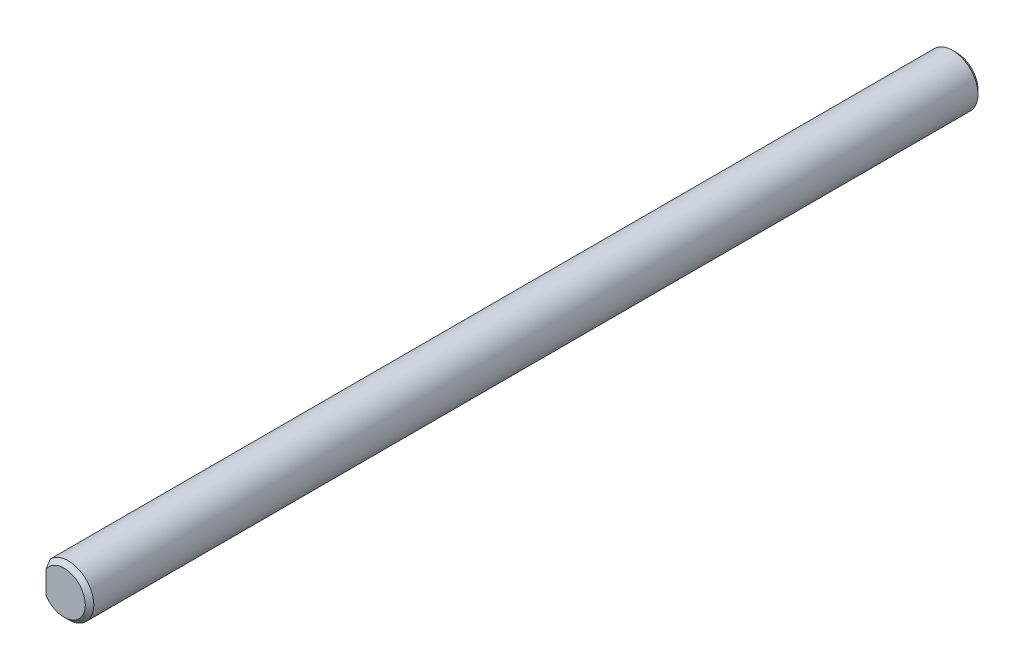
ISO-10303-21;
HEADER;
FILE_DESCRIPTION(('STEP AP214'),'2;1');
FILE_NAME('part.step','',(''),(''),'','','');
FILE_SCHEMA(('AUTOMOTIVE_DESIGN { 1 0 10303 214 1 1 1 1 }'));
ENDSEC;
DATA;
#1=APPLICATION_CONTEXT('core data for automotive mechanical design processes');
#2=APPLICATION_PROTOCOL_DEFINITION('international standard','automotive_design',2000,#1);
#3=PRODUCT_CONTEXT('',#1,'mechanical');
#4=PRODUCT('Part','Part','',(#3));
#5=PRODUCT_RELATED_PRODUCT_CATEGORY('part','',(#4));
#6=PRODUCT_DEFINITION_FORMATION('','',#4);
#7=PRODUCT_DEFINITION_CONTEXT('part definition',#1,'design');
#8=PRODUCT_DEFINITION('design','',#6,#7);
#9=PRODUCT_DEFINITION_SHAPE('','',#8);
#10=(LENGTH_UNIT() NAMED_UNIT(*) SI_UNIT(.MILLI.,.METRE.));
#11=(NAMED_UNIT(*) PLANE_ANGLE_UNIT() SI_UNIT($,.RADIAN.));
#12=(NAMED_UNIT(*) SI_UNIT($,.STERADIAN.) SOLID_ANGLE_UNIT());
#13=UNCERTAINTY_MEASURE_WITH_UNIT(LENGTH_MEASURE(1.E-05),#10,'distance_accuracy_value','');
#14=(GEOMETRIC_REPRESENTATION_CONTEXT(3) GLOBAL_UNCERTAINTY_ASSIGNED_CONTEXT((#13)) GLOBAL_UNIT_ASSIGNED_CONTEXT((#10,
#11,#12)) REPRESENTATION_CONTEXT('',''));
#15=CARTESIAN_POINT('',(0.,0.,0.));
#16=DIRECTION('',(0.,0.,1.));
#17=DIRECTION('',(1.,0.,0.));
#18=AXIS2_PLACEMENT_3D('',#15,#16,#17);
#19=CARTESIAN_POINT('',(0.,0.,105.));
#20=DIRECTION('',(0.,0.,-1.));
#21=DIRECTION('',(-1.,0.,0.));
#22=AXIS2_PLACEMENT_3D('',#19,#20,#21);
#23=CYLINDRICAL_SURFACE('',#22,3.);
#24=DIRECTION('',(0.,0.,1.));
#25=VECTOR('',#24,1.);
#26=CARTESIAN_POINT('',(-2.12132034355964,2.12132034355964,95.));
#27=LINE('',#26,#25);
#28=CARTESIAN_POINT('',(-2.12132034355964,2.12132034355964,95.));
#29=VERTEX_POINT('',#28);
#30=CARTESIAN_POINT('',(-2.12132034355964,2.12132034355964,104.5));
#31=VERTEX_POINT('',#30);
#32=EDGE_CURVE('E1365',#29,#31,#27,.T.);
#33=ORIENTED_EDGE('',*,*,#32,.T.);
#34=CARTESIAN_POINT('',(0.,0.,104.5));
#35=DIRECTION('',(0.,0.,1.));
#36=DIRECTION('',(1.,0.,0.));
#37=AXIS2_PLACEMENT_3D('',#34,#35,#36);
#38=CIRCLE('',#37,3.);
#39=CARTESIAN_POINT('',(-2.12132034355964,-2.12132034355964,104.5));
#40=VERTEX_POINT('',#39);
#41=EDGE_CURVE('E1387',#31,#40,#38,.F.);
#42=ORIENTED_EDGE('',*,*,#41,.T.);
#43=DIRECTION('',(0.,0.,1.));
#44=VECTOR('',#43,1.);
#45=CARTESIAN_POINT('',(-2.12132034355964,-2.12132034355964,95.));
#46=LINE('',#45,#44);
#47=CARTESIAN_POINT('',(-2.12132034355964,-2.12132034355964,95.));
#48=VERTEX_POINT('',#47);
#49=EDGE_CURVE('E1363',#48,#40,#46,.T.);
#50=ORIENTED_EDGE('',*,*,#49,.F.);
#51=CARTESIAN_POINT('',(0.,0.,95.));
#52=DIRECTION('',(0.,0.,1.));
#53=DIRECTION('',(1.,0.,0.));
#54=AXIS2_PLACEMENT_3D('',#51,#52,#53);
#55=CIRCLE('',#54,3.);
#56=EDGE_CURVE('E1353',#29,#48,#55,.T.);
#57=ORIENTED_EDGE('',*,*,#56,.F.);
#58=EDGE_LOOP('',(#33,#42,#50,#57));
#59=FACE_BOUND('',#58,.T.);
#60=DIRECTION('',(0.,0.,-1.));
#61=VECTOR('',#60,1.);
#62=CARTESIAN_POINT('',(-2.12132034355964,-2.12132034355964,30.));
#63=LINE('',#62,#61);
#64=CARTESIAN_POINT('',(-2.12132034355964,-2.12132034355964,30.));
#65=VERTEX_POINT('',#64);
#66=CARTESIAN_POINT('',(-2.12132034355964,-2.12132034355964,0.5));
#67=VERTEX_POINT('',#66);
#68=EDGE_CURVE('E1383',#65,#67,#63,.T.);
#69=ORIENTED_EDGE('',*,*,#68,.T.);
#70=CARTESIAN_POINT('',(0.,0.,0.5));
#71=DIRECTION('',(0.,0.,1.));
#72=DIRECTION('',(1.,0.,0.));
#73=AXIS2_PLACEMENT_3D('',#70,#71,#72);
#74=CIRCLE('',#73,3.);
#75=CARTESIAN_POINT('',(-2.12132034355964,2.12132034355964,0.5));
#76=VERTEX_POINT('',#75);
#77=EDGE_CURVE('E1393',#67,#76,#74,.T.);
#78=ORIENTED_EDGE('',*,*,#77,.T.);
#79=DIRECTION('',(0.,0.,-1.));
#80=VECTOR('',#79,1.);
#81=CARTESIAN_POINT('',(-2.12132034355964,2.12132034355964,30.));
#82=LINE('',#81,#80);
#83=CARTESIAN_POINT('',(-2.12132034355964,2.12132034355964,30.));
#84=VERTEX_POINT('',#83);
#85=EDGE_CURVE('E1379',#84,#76,#82,.T.);
#86=ORIENTED_EDGE('',*,*,#85,.F.);
#87=CARTESIAN_POINT('',(0.,0.,30.));
#88=DIRECTION('',(0.,0.,-1.));
#89=DIRECTION('',(-1.,0.,0.));
#90=AXIS2_PLACEMENT_3D('',#87,#88,#89);
#91=CIRCLE('',#90,3.);
#92=EDGE_CURVE('E1372',#65,#84,#91,.T.);
#93=ORIENTED_EDGE('',*,*,#92,.F.);
#94=EDGE_LOOP('',(#69,#78,#86,#93));
#95=FACE_BOUND('',#94,.T.);
#96=ADVANCED_FACE('F1273',(#59,#95),#23,.T.);
#97=CARTESIAN_POINT('',(0.,0.,105.));
#98=DIRECTION('',(0.,0.,1.));
#99=DIRECTION('',(1.,0.,0.));
#100=AXIS2_PLACEMENT_3D('',#97,#98,#99);
#101=PLANE('',#100);
#102=DIRECTION('',(0.,1.,0.));
#103=VECTOR('',#102,1.);
#104=CARTESIAN_POINT('',(-2.12132034355964,0.,105.));
#105=LINE('',#104,#103);
#106=CARTESIAN_POINT('',(-2.12132034355964,-1.32287565553233,105.));
#107=VERTEX_POINT('',#106);
#108=CARTESIAN_POINT('',(-2.12132034355964,1.32287565553233,105.));
#109=VERTEX_POINT('',#108);
#110=EDGE_CURVE('E1346',#107,#109,#105,.T.);
#111=ORIENTED_EDGE('',*,*,#110,.F.);
#112=CARTESIAN_POINT('',(0.,0.,105.));
#113=DIRECTION('',(0.,0.,1.));
#114=DIRECTION('',(1.,0.,0.));
#115=AXIS2_PLACEMENT_3D('',#112,#113,#114);
#116=CIRCLE('',#115,2.50000000000002);
#117=EDGE_CURVE('E1450',#107,#109,#116,.T.);
#118=ORIENTED_EDGE('',*,*,#117,.T.);
#119=EDGE_LOOP('',(#111,#118));
#120=FACE_BOUND('',#119,.T.);
#121=ADVANCED_FACE('F1423',(#120),#101,.T.);
#122=CARTESIAN_POINT('',(0.,0.,0.));
#123=DIRECTION('',(0.,0.,1.));
#124=DIRECTION('',(1.,0.,0.));
#125=AXIS2_PLACEMENT_3D('',#122,#123,#124);
#126=PLANE('',#125);
#127=CARTESIAN_POINT('',(0.,0.,0.));
#128=DIRECTION('',(0.,0.,-1.));
#129=DIRECTION('',(-1.,0.,0.));
#130=AXIS2_PLACEMENT_3D('',#127,#128,#129);
#131=CIRCLE('',#130,1.24999999999999);
#132=CARTESIAN_POINT('',(-1.24999999999999,0.,0.));
#133=VERTEX_POINT('',#132);
#134=EDGE_CURVE('E1347',#133,#133,#131,.T.);
#135=ORIENTED_EDGE('',*,*,#134,.F.);
#136=EDGE_LOOP('',(#135));
#137=FACE_BOUND('',#136,.T.);
#138=DIRECTION('',(0.,-1.,0.));
#139=VECTOR('',#138,1.);
#140=CARTESIAN_POINT('',(-2.12132034355964,0.,0.));
#141=LINE('',#140,#139);
#142=CARTESIAN_POINT('',(-2.12132034355964,1.3228756555323,0.));
#143=VERTEX_POINT('',#142);
#144=CARTESIAN_POINT('',(-2.12132034355964,-1.3228756555323,0.));
#145=VERTEX_POINT('',#144);
#146=EDGE_CURVE('E1369',#143,#145,#141,.T.);
#147=ORIENTED_EDGE('',*,*,#146,.F.);
#148=CARTESIAN_POINT('',(0.,0.,0.));
#149=DIRECTION('',(0.,0.,1.));
#150=DIRECTION('',(1.,0.,0.));
#151=AXIS2_PLACEMENT_3D('',#148,#149,#150);
#152=CIRCLE('',#151,2.5);
#153=EDGE_CURVE('E1444',#143,#145,#152,.F.);
#154=ORIENTED_EDGE('',*,*,#153,.T.);
#155=EDGE_LOOP('',(#147,#154));
#156=FACE_BOUND('',#155,.T.);
#157=ADVANCED_FACE('F1421',(#137,#156),#126,.F.);
#158=CARTESIAN_POINT('',(-2.12132034355964,0.,30.));
#159=DIRECTION('',(1.,0.,0.));
#160=DIRECTION('',(0.,0.,-1.));
#161=AXIS2_PLACEMENT_3D('',#158,#159,#160);
#162=PLANE('',#161);
#163=ORIENTED_EDGE('',*,*,#85,.T.);
#164=CARTESIAN_POINT('',(-2.12132034355964,2.12132034355964,0.5));
#165=CARTESIAN_POINT('',(-2.12132034355964,2.057150349237,0.454641875638872));
#166=CARTESIAN_POINT('',(-2.12132034355964,1.99250337372897,0.409942314784703));
#167=CARTESIAN_POINT('',(-2.12132034355964,1.86214332555769,0.322273768220019));
#168=CARTESIAN_POINT('',(-2.12132034355964,1.7964313951967,0.279303080777996));
#169=CARTESIAN_POINT('',(-2.12132034355964,1.66368168334487,0.195400793709425));
#170=CARTESIAN_POINT('',(-2.12132034355964,1.5966435323941,0.154469773796638));
#171=CARTESIAN_POINT('',(-2.12132034355964,1.46098397930878,0.0751655929118614));
#172=CARTESIAN_POINT('',(-2.12132034355964,1.39236104081728,0.0367950674542279));
#173=CARTESIAN_POINT('',(-2.12132034355964,1.3228756555323,0.));
#174=B_SPLINE_CURVE_WITH_KNOTS('',3,(#164,#165,#166,#167,#168,#169,#170,#171,#172,#173),
.UNSPECIFIED.,.F.,.F.,(4,2,2,2,4),(0.,0.235755368792439,0.471272703908698,0.706856600308596,
0.942679357394607),.UNSPECIFIED.);
#175=EDGE_CURVE('E1405',#76,#143,#174,.T.);
#176=ORIENTED_EDGE('',*,*,#175,.T.);
#177=ORIENTED_EDGE('',*,*,#146,.T.);
#178=CARTESIAN_POINT('',(-2.12132034355964,-1.3228756555323,0.));
#179=CARTESIAN_POINT('',(-2.12132034355964,-1.39236104081728,0.0367950674542276));
#180=CARTESIAN_POINT('',(-2.12132034355964,-1.46098397930878,0.0751655929118612));
#181=CARTESIAN_POINT('',(-2.12132034355964,-1.5966435323941,0.154469773796638));
#182=CARTESIAN_POINT('',(-2.12132034355964,-1.66368168334487,0.195400793709425));
#183=CARTESIAN_POINT('',(-2.12132034355964,-1.7964313951967,0.279303080777997));
#184=CARTESIAN_POINT('',(-2.12132034355964,-1.86214332555769,0.32227376822002));
#185=CARTESIAN_POINT('',(-2.12132034355964,-1.99250337372897,0.409942314784703));
#186=CARTESIAN_POINT('',(-2.12132034355964,-2.057150349237,0.454641875638872));
#187=CARTESIAN_POINT('',(-2.12132034355964,-2.12132034355964,0.5));
#188=B_SPLINE_CURVE_WITH_KNOTS('',3,(#178,#179,#180,#181,#182,#183,#184,#185,#186,#187),
.UNSPECIFIED.,.F.,.F.,(4,2,2,2,4),(0.,0.235822757086011,0.47140665348591,0.706923988602168,
0.942679357394607),.UNSPECIFIED.);
#189=EDGE_CURVE('E1397',#145,#67,#188,.T.);
#190=ORIENTED_EDGE('',*,*,#189,.T.);
#191=ORIENTED_EDGE('',*,*,#68,.F.);
#192=DIRECTION('',(0.,-1.,0.));
#193=VECTOR('',#192,1.);
#194=CARTESIAN_POINT('',(-2.12132034355964,0.,30.));
#195=LINE('',#194,#193);
#196=EDGE_CURVE('E1375',#84,#65,#195,.T.);
#197=ORIENTED_EDGE('',*,*,#196,.F.);
#198=EDGE_LOOP('',(#163,#176,#177,#190,#191,#197));
#199=FACE_BOUND('',#198,.T.);
#200=ADVANCED_FACE('F1415',(#199),#162,.F.);
#201=CARTESIAN_POINT('',(0.,0.,30.));
#202=DIRECTION('',(0.,0.,-1.));
#203=DIRECTION('',(-1.,0.,0.));
#204=AXIS2_PLACEMENT_3D('',#201,#202,#203);
#205=PLANE('',#204);
#206=ORIENTED_EDGE('',*,*,#92,.T.);
#207=ORIENTED_EDGE('',*,*,#196,.T.);
#208=EDGE_LOOP('',(#206,#207));
#209=FACE_BOUND('',#208,.T.);
#210=ADVANCED_FACE('F1420',(#209),#205,.T.);
#211=CARTESIAN_POINT('',(-2.12132034355964,0.,95.));
#212=DIRECTION('',(1.,0.,0.));
#213=DIRECTION('',(0.,0.,-1.));
#214=AXIS2_PLACEMENT_3D('',#211,#212,#213);
#215=PLANE('',#214);
#216=ORIENTED_EDGE('',*,*,#110,.T.);
#217=CARTESIAN_POINT('',(-2.12132034355964,1.32287565553233,105.));
#218=CARTESIAN_POINT('',(-2.12132034355964,1.39236104081731,104.963204932546));
#219=CARTESIAN_POINT('',(-2.12132034355964,1.46098397930881,104.924834407088));
#220=CARTESIAN_POINT('',(-2.12132034355964,1.59664353239412,104.845530226203));
#221=CARTESIAN_POINT('',(-2.12132034355964,1.66368168334489,104.804599206291));
#222=CARTESIAN_POINT('',(-2.12132034355964,1.79643139519671,104.720696919222));
#223=CARTESIAN_POINT('',(-2.12132034355964,1.8621433255577,104.67772623178));
#224=CARTESIAN_POINT('',(-2.12132034355964,1.99250337372898,104.590057685215));
#225=CARTESIAN_POINT('',(-2.12132034355964,2.057150349237,104.545358124361));
#226=CARTESIAN_POINT('',(-2.12132034355964,2.12132034355964,104.5));
#227=B_SPLINE_CURVE_WITH_KNOTS('',3,(#217,#218,#219,#220,#221,#222,#223,#224,#225,#226),
.UNSPECIFIED.,.F.,.F.,(4,2,2,2,4),(0.,0.235822757086013,0.471406653485888,0.706923988602149,
0.942679357394577),.UNSPECIFIED.);
#228=EDGE_CURVE('E12',#109,#31,#227,.T.);
#229=ORIENTED_EDGE('',*,*,#228,.T.);
#230=ORIENTED_EDGE('',*,*,#32,.F.);
#231=DIRECTION('',(0.,1.,0.));
#232=VECTOR('',#231,1.);
#233=CARTESIAN_POINT('',(-2.12132034355964,0.,95.));
#234=LINE('',#233,#232);
#235=EDGE_CURVE('E1360',#48,#29,#234,.T.);
#236=ORIENTED_EDGE('',*,*,#235,.F.);
#237=ORIENTED_EDGE('',*,*,#49,.T.);
#238=CARTESIAN_POINT('',(-2.12132034355964,-2.12132034355964,104.5));
#239=CARTESIAN_POINT('',(-2.12132034355964,-2.057150349237,104.545358124361));
#240=CARTESIAN_POINT('',(-2.12132034355964,-1.99250337372898,104.590057685215));
#241=CARTESIAN_POINT('',(-2.12132034355964,-1.8621433255577,104.67772623178));
#242=CARTESIAN_POINT('',(-2.12132034355964,-1.79643139519671,104.720696919222));
#243=CARTESIAN_POINT('',(-2.12132034355964,-1.66368168334489,104.804599206291));
#244=CARTESIAN_POINT('',(-2.12132034355964,-1.59664353239411,104.845530226203));
#245=CARTESIAN_POINT('',(-2.12132034355964,-1.4609839793088,104.924834407088));
#246=CARTESIAN_POINT('',(-2.12132034355964,-1.3923610408173,104.963204932546));
#247=CARTESIAN_POINT('',(-2.12132034355964,-1.32287565553232,105.));
#248=B_SPLINE_CURVE_WITH_KNOTS('',3,(#238,#239,#240,#241,#242,#243,#244,#245,#246,#247),
.UNSPECIFIED.,.F.,.F.,(4,2,2,2,4),(0.,0.235755368792429,0.47127270390869,0.706856600308571,
0.94267935739458),.UNSPECIFIED.);
#249=EDGE_CURVE('E1289',#40,#107,#248,.T.);
#250=ORIENTED_EDGE('',*,*,#249,.T.);
#251=EDGE_LOOP('',(#216,#229,#230,#236,#237,#250));
#252=FACE_BOUND('',#251,.T.);
#253=ADVANCED_FACE('F1461',(#252),#215,.F.);
#254=CARTESIAN_POINT('',(0.,0.,95.));
#255=DIRECTION('',(0.,0.,1.));
#256=DIRECTION('',(1.,0.,0.));
#257=AXIS2_PLACEMENT_3D('',#254,#255,#256);
#258=PLANE('',#257);
#259=ORIENTED_EDGE('',*,*,#56,.T.);
#260=ORIENTED_EDGE('',*,*,#235,.T.);
#261=EDGE_LOOP('',(#259,#260));
#262=FACE_BOUND('',#261,.T.);
#263=ADVANCED_FACE('F1339',(#262),#258,.T.);
#264=CARTESIAN_POINT('',(0.,0.,10.));
#265=DIRECTION('',(0.,0.,-1.));
#266=DIRECTION('',(-1.,0.,0.));
#267=AXIS2_PLACEMENT_3D('',#264,#265,#266);
#268=CONICAL_SURFACE('',#267,1.25,1.02974425867665);
#269=CARTESIAN_POINT('',(0.,0.,10.7510757737845));
#270=VERTEX_POINT('',#269);
#271=VERTEX_LOOP('',#270);
#272=FACE_BOUND('',#271,.T.);
#273=CARTESIAN_POINT('',(0.,0.,10.));
#274=DIRECTION('',(0.,0.,-1.));
#275=DIRECTION('',(-1.,0.,0.));
#276=AXIS2_PLACEMENT_3D('',#273,#274,#275);
#277=CIRCLE('',#276,1.25);
#278=CARTESIAN_POINT('',(-1.25,0.,10.));
#279=VERTEX_POINT('',#278);
#280=EDGE_CURVE('E1343',#279,#279,#277,.T.);
#281=ORIENTED_EDGE('',*,*,#280,.T.);
#282=EDGE_LOOP('',(#281));
#283=FACE_BOUND('',#282,.T.);
#284=ADVANCED_FACE('F1335',(#272,#283),#268,.F.);
#285=CARTESIAN_POINT('',(0.,0.,0.));
#286=DIRECTION('',(0.,0.,-1.));
#287=DIRECTION('',(-1.,0.,0.));
#288=AXIS2_PLACEMENT_3D('',#285,#286,#287);
#289=CYLINDRICAL_SURFACE('',#288,1.24999999999999);
#290=ORIENTED_EDGE('',*,*,#280,.F.);
#291=EDGE_LOOP('',(#290));
#292=FACE_BOUND('',#291,.T.);
#293=ORIENTED_EDGE('',*,*,#134,.T.);
#294=EDGE_LOOP('',(#293));
#295=FACE_BOUND('',#294,.T.);
#296=ADVANCED_FACE('F1338',(#292,#295),#289,.F.);
#297=CARTESIAN_POINT('',(0.,0.,0.5));
#298=DIRECTION('',(0.,0.,1.));
#299=DIRECTION('',(1.,0.,0.));
#300=AXIS2_PLACEMENT_3D('',#297,#298,#299);
#301=CONICAL_SURFACE('',#300,3.,0.785398163397446);
#302=ORIENTED_EDGE('',*,*,#189,.F.);
#303=ORIENTED_EDGE('',*,*,#153,.F.);
#304=ORIENTED_EDGE('',*,*,#175,.F.);
#305=ORIENTED_EDGE('',*,*,#77,.F.);
#306=EDGE_LOOP('',(#302,#303,#304,#305));
#307=FACE_BOUND('',#306,.T.);
#308=ADVANCED_FACE('F1412',(#307),#301,.T.);
#309=CARTESIAN_POINT('',(0.,0.,105.));
#310=DIRECTION('',(0.,0.,-1.));
#311=DIRECTION('',(-1.,0.,0.));
#312=AXIS2_PLACEMENT_3D('',#309,#310,#311);
#313=CONICAL_SURFACE('',#312,2.50000000000002,0.785398163397446);
#314=ORIENTED_EDGE('',*,*,#249,.F.);
#315=ORIENTED_EDGE('',*,*,#41,.F.);
#316=ORIENTED_EDGE('',*,*,#228,.F.);
#317=ORIENTED_EDGE('',*,*,#117,.F.);
#318=EDGE_LOOP('',(#314,#315,#316,#317));
#319=FACE_BOUND('',#318,.T.);
#320=ADVANCED_FACE('F1276',(#319),#313,.T.);
#321=CLOSED_SHELL('',(#96,#121,#157,#200,#210,#253,#263,#284,#296,#308,#320));
#322=MANIFOLD_SOLID_BREP('B2',#321);
#323=ADVANCED_BREP_SHAPE_REPRESENTATION('',(#18,#322),#14);
#324=SHAPE_DEFINITION_REPRESENTATION(#9,#323);
ENDSEC;
END-ISO-10303-21;
